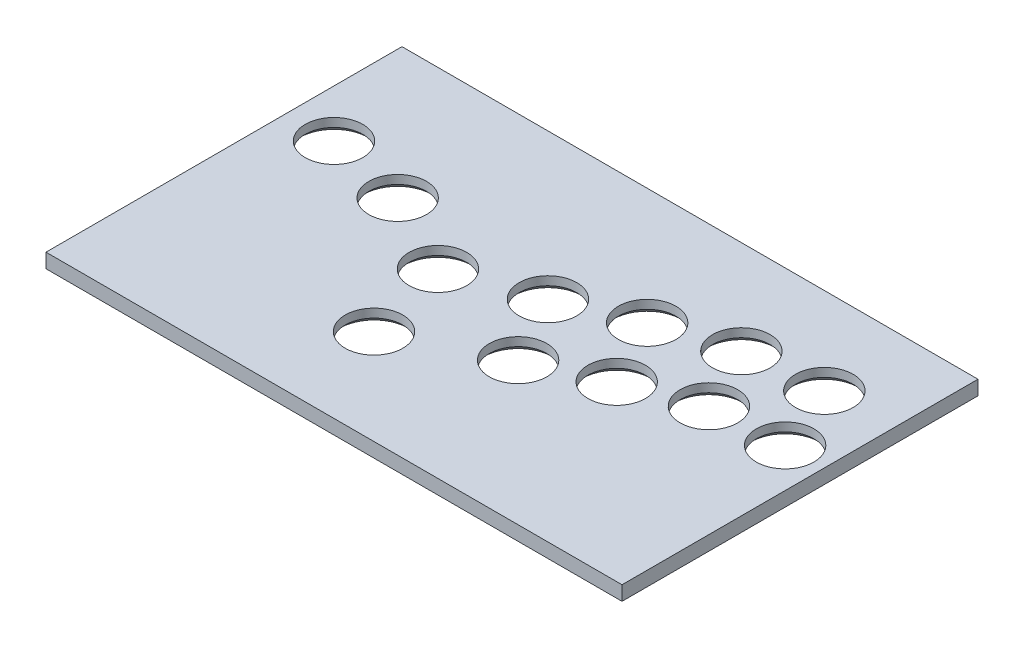
ISO-10303-21;
HEADER;
FILE_DESCRIPTION(('STEP AP214'),'2;1');
FILE_NAME('part.step','',(''),(''),'','','');
FILE_SCHEMA(('AUTOMOTIVE_DESIGN { 1 0 10303 214 1 1 1 1 }'));
ENDSEC;
DATA;
#1=APPLICATION_CONTEXT('core data for automotive mechanical design processes');
#2=APPLICATION_PROTOCOL_DEFINITION('international standard','automotive_design',2000,#1);
#3=PRODUCT_CONTEXT('',#1,'mechanical');
#4=PRODUCT('Part','Part','',(#3));
#5=PRODUCT_RELATED_PRODUCT_CATEGORY('part','',(#4));
#6=PRODUCT_DEFINITION_FORMATION('','',#4);
#7=PRODUCT_DEFINITION_CONTEXT('part definition',#1,'design');
#8=PRODUCT_DEFINITION('design','',#6,#7);
#9=PRODUCT_DEFINITION_SHAPE('','',#8);
#10=(LENGTH_UNIT() NAMED_UNIT(*) SI_UNIT(.MILLI.,.METRE.));
#11=(NAMED_UNIT(*) PLANE_ANGLE_UNIT() SI_UNIT($,.RADIAN.));
#12=(NAMED_UNIT(*) SI_UNIT($,.STERADIAN.) SOLID_ANGLE_UNIT());
#13=UNCERTAINTY_MEASURE_WITH_UNIT(LENGTH_MEASURE(1.E-05),#10,'distance_accuracy_value','');
#14=(GEOMETRIC_REPRESENTATION_CONTEXT(3) GLOBAL_UNCERTAINTY_ASSIGNED_CONTEXT((#13)) GLOBAL_UNIT_ASSIGNED_CONTEXT((#10,
#11,#12)) REPRESENTATION_CONTEXT('',''));
#15=CARTESIAN_POINT('',(0.,0.,0.));
#16=DIRECTION('',(0.,0.,1.));
#17=DIRECTION('',(1.,0.,0.));
#18=AXIS2_PLACEMENT_3D('',#15,#16,#17);
#19=CARTESIAN_POINT('',(0.,5.,0.));
#20=DIRECTION('',(0.,1.,0.));
#21=DIRECTION('',(0.,0.,1.));
#22=AXIS2_PLACEMENT_3D('',#19,#20,#21);
#23=PLANE('',#22);
#24=CARTESIAN_POINT('',(75.0407534181711,5.,29.2050171292449));
#25=DIRECTION('',(0.,1.,0.));
#26=DIRECTION('',(0.,0.,1.));
#27=AXIS2_PLACEMENT_3D('',#24,#25,#26);
#28=CIRCLE('',#27,9.99999999999999);
#29=CARTESIAN_POINT('',(75.0407534181711,5.,39.2050171292449));
#30=VERTEX_POINT('',#29);
#31=EDGE_CURVE('E318',#30,#30,#28,.T.);
#32=ORIENTED_EDGE('',*,*,#31,.F.);
#33=EDGE_LOOP('',(#32));
#34=FACE_BOUND('',#33,.T.);
#35=CARTESIAN_POINT('',(50.034895936804,5.,30.6576941138553));
#36=DIRECTION('',(0.,1.,0.));
#37=DIRECTION('',(0.,0.,1.));
#38=AXIS2_PLACEMENT_3D('',#35,#36,#37);
#39=CIRCLE('',#38,9.99999999999999);
#40=CARTESIAN_POINT('',(50.034895936804,5.,40.6576941138553));
#41=VERTEX_POINT('',#40);
#42=EDGE_CURVE('E328',#41,#41,#39,.T.);
#43=ORIENTED_EDGE('',*,*,#42,.F.);
#44=EDGE_LOOP('',(#43));
#45=FACE_BOUND('',#44,.T.);
#46=CARTESIAN_POINT('',(3.0501318978968,5.,49.9237409318293));
#47=DIRECTION('',(0.,1.,0.));
#48=DIRECTION('',(0.,0.,1.));
#49=AXIS2_PLACEMENT_3D('',#46,#47,#48);
#50=CIRCLE('',#49,10.);
#51=CARTESIAN_POINT('',(3.0501318978968,5.,59.9237409318293));
#52=VERTEX_POINT('',#51);
#53=EDGE_CURVE('E340',#52,#52,#50,.T.);
#54=ORIENTED_EDGE('',*,*,#53,.F.);
#55=EDGE_LOOP('',(#54));
#56=FACE_BOUND('',#55,.T.);
#57=CARTESIAN_POINT('',(65.4494693229309,5.,6.0021017109609));
#58=DIRECTION('',(0.,1.,0.));
#59=DIRECTION('',(0.,0.,1.));
#60=AXIS2_PLACEMENT_3D('',#57,#58,#59);
#61=CIRCLE('',#60,9.99999999999999);
#62=CARTESIAN_POINT('',(65.4494693229309,5.,16.0021017109609));
#63=VERTEX_POINT('',#62);
#64=EDGE_CURVE('E341',#63,#63,#61,.T.);
#65=ORIENTED_EDGE('',*,*,#64,.F.);
#66=EDGE_LOOP('',(#65));
#67=FACE_BOUND('',#66,.T.);
#68=CARTESIAN_POINT('',(-94.8236506551659,5.,15.9793701865854));
#69=DIRECTION('',(0.,1.,0.));
#70=DIRECTION('',(0.,0.,1.));
#71=AXIS2_PLACEMENT_3D('',#68,#69,#70);
#72=CIRCLE('',#71,9.99999999999999);
#73=CARTESIAN_POINT('',(-94.8236506551659,5.,25.9793701865854));
#74=VERTEX_POINT('',#73);
#75=EDGE_CURVE('E352',#74,#74,#72,.T.);
#76=ORIENTED_EDGE('',*,*,#75,.F.);
#77=EDGE_LOOP('',(#76));
#78=FACE_BOUND('',#77,.T.);
#79=CARTESIAN_POINT('',(-30.5462221917152,5.,66.3515096844472));
#80=DIRECTION('',(0.,1.,0.));
#81=DIRECTION('',(0.,0.,1.));
#82=AXIS2_PLACEMENT_3D('',#79,#80,#81);
#83=CIRCLE('',#82,9.99999999999999);
#84=CARTESIAN_POINT('',(-30.5462221917152,5.,76.3515096844472));
#85=VERTEX_POINT('',#84);
#86=EDGE_CURVE('E123',#85,#85,#83,.T.);
#87=ORIENTED_EDGE('',*,*,#86,.F.);
#88=EDGE_LOOP('',(#87));
#89=FACE_BOUND('',#88,.T.);
#90=DIRECTION('',(0.,0.,1.));
#91=VECTOR('',#90,1.);
#92=CARTESIAN_POINT('',(-111.382571904587,5.,-24.1861841220525));
#93=LINE('',#92,#91);
#94=CARTESIAN_POINT('',(-111.382571904587,5.,-24.1861841220525));
#95=VERTEX_POINT('',#94);
#96=CARTESIAN_POINT('',(-111.382571904587,5.,99.4138158779475));
#97=VERTEX_POINT('',#96);
#98=EDGE_CURVE('E99',#95,#97,#93,.T.);
#99=ORIENTED_EDGE('',*,*,#98,.T.);
#100=DIRECTION('',(1.,0.,0.));
#101=VECTOR('',#100,1.);
#102=CARTESIAN_POINT('',(-111.382571904587,5.,99.4138158779475));
#103=LINE('',#102,#101);
#104=CARTESIAN_POINT('',(88.6174280954135,5.,99.4138158779475));
#105=VERTEX_POINT('',#104);
#106=EDGE_CURVE('E92',#97,#105,#103,.T.);
#107=ORIENTED_EDGE('',*,*,#106,.T.);
#108=DIRECTION('',(0.,0.,-1.));
#109=VECTOR('',#108,1.);
#110=CARTESIAN_POINT('',(88.6174280954135,5.,-24.1861841220525));
#111=LINE('',#110,#109);
#112=CARTESIAN_POINT('',(88.6174280954135,5.,-24.1861841220525));
#113=VERTEX_POINT('',#112);
#114=EDGE_CURVE('E98',#105,#113,#111,.T.);
#115=ORIENTED_EDGE('',*,*,#114,.T.);
#116=DIRECTION('',(-1.,0.,0.));
#117=VECTOR('',#116,1.);
#118=CARTESIAN_POINT('',(-111.382571904587,5.,-24.1861841220525));
#119=LINE('',#118,#117);
#120=EDGE_CURVE('E61',#113,#95,#119,.T.);
#121=ORIENTED_EDGE('',*,*,#120,.T.);
#122=EDGE_LOOP('',(#99,#107,#115,#121));
#123=FACE_BOUND('',#122,.T.);
#124=CARTESIAN_POINT('',(-66.6325345394884,5.,22.0571786086309));
#125=DIRECTION('',(0.,1.,0.));
#126=DIRECTION('',(0.,0.,1.));
#127=AXIS2_PLACEMENT_3D('',#124,#125,#126);
#128=CIRCLE('',#127,9.99999999999999);
#129=CARTESIAN_POINT('',(-66.6325345394884,5.,32.0571786086309));
#130=VERTEX_POINT('',#129);
#131=EDGE_CURVE('E353',#130,#130,#128,.T.);
#132=ORIENTED_EDGE('',*,*,#131,.F.);
#133=EDGE_LOOP('',(#132));
#134=FACE_BOUND('',#133,.T.);
#135=CARTESIAN_POINT('',(-10.0903471724497,5.,26.4253037606217));
#136=DIRECTION('',(0.,1.,0.));
#137=DIRECTION('',(0.,0.,1.));
#138=AXIS2_PLACEMENT_3D('',#135,#136,#137);
#139=CIRCLE('',#138,9.99999999999999);
#140=CARTESIAN_POINT('',(-10.0903471724497,5.,36.4253037606217));
#141=VERTEX_POINT('',#140);
#142=EDGE_CURVE('E350',#141,#141,#139,.T.);
#143=ORIENTED_EDGE('',*,*,#142,.F.);
#144=EDGE_LOOP('',(#143));
#145=FACE_BOUND('',#144,.T.);
#146=CARTESIAN_POINT('',(39.1205245605059,5.,8.47636758010787));
#147=DIRECTION('',(0.,1.,0.));
#148=DIRECTION('',(0.,0.,1.));
#149=AXIS2_PLACEMENT_3D('',#146,#147,#148);
#150=CIRCLE('',#149,9.99999999999999);
#151=CARTESIAN_POINT('',(39.1205245605059,5.,18.4763675801079));
#152=VERTEX_POINT('',#151);
#153=EDGE_CURVE('E342',#152,#152,#150,.T.);
#154=ORIENTED_EDGE('',*,*,#153,.F.);
#155=EDGE_LOOP('',(#154));
#156=FACE_BOUND('',#155,.T.);
#157=CARTESIAN_POINT('',(26.6846448120867,5.,39.3297349593777));
#158=DIRECTION('',(0.,1.,0.));
#159=DIRECTION('',(0.,0.,1.));
#160=AXIS2_PLACEMENT_3D('',#157,#158,#159);
#161=CIRCLE('',#160,9.99999999999999);
#162=CARTESIAN_POINT('',(26.6846448120867,5.,49.3297349593777));
#163=VERTEX_POINT('',#162);
#164=EDGE_CURVE('E334',#163,#163,#161,.T.);
#165=ORIENTED_EDGE('',*,*,#164,.F.);
#166=EDGE_LOOP('',(#165));
#167=FACE_BOUND('',#166,.T.);
#168=CARTESIAN_POINT('',(-38.2869015354953,5.,36.4229076061929));
#169=DIRECTION('',(0.,1.,0.));
#170=DIRECTION('',(0.,0.,1.));
#171=AXIS2_PLACEMENT_3D('',#168,#169,#170);
#172=CIRCLE('',#171,9.99999999999999);
#173=CARTESIAN_POINT('',(-38.2869015354953,5.,46.4229076061929));
#174=VERTEX_POINT('',#173);
#175=EDGE_CURVE('E323',#174,#174,#172,.T.);
#176=ORIENTED_EDGE('',*,*,#175,.F.);
#177=EDGE_LOOP('',(#176));
#178=FACE_BOUND('',#177,.T.);
#179=CARTESIAN_POINT('',(14.2287706379459,5.,16.2919651162933));
#180=DIRECTION('',(0.,1.,0.));
#181=DIRECTION('',(0.,0.,1.));
#182=AXIS2_PLACEMENT_3D('',#179,#180,#181);
#183=CIRCLE('',#182,9.99999999999999);
#184=CARTESIAN_POINT('',(14.2287706379459,5.,26.2919651162933));
#185=VERTEX_POINT('',#184);
#186=EDGE_CURVE('E312',#185,#185,#183,.T.);
#187=ORIENTED_EDGE('',*,*,#186,.F.);
#188=EDGE_LOOP('',(#187));
#189=FACE_BOUND('',#188,.T.);
#190=ADVANCED_FACE('F44',(#34,#45,#56,#67,#78,#89,#123,#134,#145,#156,#167,#178,#189),#23,.T.);
#191=CARTESIAN_POINT('',(0.,0.,0.));
#192=DIRECTION('',(0.,1.,0.));
#193=DIRECTION('',(0.,0.,1.));
#194=AXIS2_PLACEMENT_3D('',#191,#192,#193);
#195=PLANE('',#194);
#196=CARTESIAN_POINT('',(-94.8236506551659,0.,15.9793701865854));
#197=DIRECTION('',(0.,1.,0.));
#198=DIRECTION('',(0.,0.,1.));
#199=AXIS2_PLACEMENT_3D('',#196,#197,#198);
#200=CIRCLE('',#199,12.);
#201=CARTESIAN_POINT('',(-94.8236506551659,0.,27.9793701865854));
#202=VERTEX_POINT('',#201);
#203=EDGE_CURVE('E182',#202,#202,#200,.T.);
#204=ORIENTED_EDGE('',*,*,#203,.T.);
#205=EDGE_LOOP('',(#204));
#206=FACE_BOUND('',#205,.T.);
#207=CARTESIAN_POINT('',(-66.6325345394884,0.,22.0571786086309));
#208=DIRECTION('',(0.,1.,0.));
#209=DIRECTION('',(0.,0.,1.));
#210=AXIS2_PLACEMENT_3D('',#207,#208,#209);
#211=CIRCLE('',#210,12.);
#212=CARTESIAN_POINT('',(-66.6325345394884,0.,34.0571786086308));
#213=VERTEX_POINT('',#212);
#214=EDGE_CURVE('E179',#213,#213,#211,.T.);
#215=ORIENTED_EDGE('',*,*,#214,.T.);
#216=EDGE_LOOP('',(#215));
#217=FACE_BOUND('',#216,.T.);
#218=CARTESIAN_POINT('',(-38.2869015354953,0.,36.4229076061929));
#219=DIRECTION('',(0.,1.,0.));
#220=DIRECTION('',(0.,0.,1.));
#221=AXIS2_PLACEMENT_3D('',#218,#219,#220);
#222=CIRCLE('',#221,12.);
#223=CARTESIAN_POINT('',(-38.2869015354953,0.,48.4229076061929));
#224=VERTEX_POINT('',#223);
#225=EDGE_CURVE('E174',#224,#224,#222,.T.);
#226=ORIENTED_EDGE('',*,*,#225,.T.);
#227=EDGE_LOOP('',(#226));
#228=FACE_BOUND('',#227,.T.);
#229=CARTESIAN_POINT('',(-30.5462221917152,0.,66.3515096844472));
#230=DIRECTION('',(0.,1.,0.));
#231=DIRECTION('',(0.,0.,1.));
#232=AXIS2_PLACEMENT_3D('',#229,#230,#231);
#233=CIRCLE('',#232,12.);
#234=CARTESIAN_POINT('',(-30.5462221917152,0.,78.3515096844471));
#235=VERTEX_POINT('',#234);
#236=EDGE_CURVE('E166',#235,#235,#233,.T.);
#237=ORIENTED_EDGE('',*,*,#236,.T.);
#238=EDGE_LOOP('',(#237));
#239=FACE_BOUND('',#238,.T.);
#240=CARTESIAN_POINT('',(3.0501318978968,0.,49.9237409318293));
#241=DIRECTION('',(0.,1.,0.));
#242=DIRECTION('',(0.,0.,1.));
#243=AXIS2_PLACEMENT_3D('',#240,#241,#242);
#244=CIRCLE('',#243,12.);
#245=CARTESIAN_POINT('',(3.0501318978968,0.,61.9237409318293));
#246=VERTEX_POINT('',#245);
#247=EDGE_CURVE('E167',#246,#246,#244,.T.);
#248=ORIENTED_EDGE('',*,*,#247,.T.);
#249=EDGE_LOOP('',(#248));
#250=FACE_BOUND('',#249,.T.);
#251=CARTESIAN_POINT('',(-10.0903471724497,0.,26.4253037606217));
#252=DIRECTION('',(0.,1.,0.));
#253=DIRECTION('',(0.,0.,1.));
#254=AXIS2_PLACEMENT_3D('',#251,#252,#253);
#255=CIRCLE('',#254,12.);
#256=CARTESIAN_POINT('',(-10.0903471724497,0.,38.4253037606217));
#257=VERTEX_POINT('',#256);
#258=EDGE_CURVE('E165',#257,#257,#255,.T.);
#259=ORIENTED_EDGE('',*,*,#258,.T.);
#260=EDGE_LOOP('',(#259));
#261=FACE_BOUND('',#260,.T.);
#262=CARTESIAN_POINT('',(26.6846448120867,0.,39.3297349593777));
#263=DIRECTION('',(0.,1.,0.));
#264=DIRECTION('',(0.,0.,1.));
#265=AXIS2_PLACEMENT_3D('',#262,#263,#264);
#266=CIRCLE('',#265,12.);
#267=CARTESIAN_POINT('',(26.6846448120867,0.,51.3297349593777));
#268=VERTEX_POINT('',#267);
#269=EDGE_CURVE('E158',#268,#268,#266,.T.);
#270=ORIENTED_EDGE('',*,*,#269,.T.);
#271=EDGE_LOOP('',(#270));
#272=FACE_BOUND('',#271,.T.);
#273=CARTESIAN_POINT('',(14.2287706379459,0.,16.2919651162933));
#274=DIRECTION('',(0.,1.,0.));
#275=DIRECTION('',(0.,0.,1.));
#276=AXIS2_PLACEMENT_3D('',#273,#274,#275);
#277=CIRCLE('',#276,12.);
#278=CARTESIAN_POINT('',(14.2287706379459,0.,28.2919651162933));
#279=VERTEX_POINT('',#278);
#280=EDGE_CURVE('E152',#279,#279,#277,.T.);
#281=ORIENTED_EDGE('',*,*,#280,.T.);
#282=EDGE_LOOP('',(#281));
#283=FACE_BOUND('',#282,.T.);
#284=CARTESIAN_POINT('',(50.034895936804,0.,30.6576941138553));
#285=DIRECTION('',(0.,1.,0.));
#286=DIRECTION('',(0.,0.,1.));
#287=AXIS2_PLACEMENT_3D('',#284,#285,#286);
#288=CIRCLE('',#287,12.);
#289=CARTESIAN_POINT('',(50.034895936804,0.,42.6576941138553));
#290=VERTEX_POINT('',#289);
#291=EDGE_CURVE('E147',#290,#290,#288,.T.);
#292=ORIENTED_EDGE('',*,*,#291,.T.);
#293=EDGE_LOOP('',(#292));
#294=FACE_BOUND('',#293,.T.);
#295=CARTESIAN_POINT('',(75.0407534181711,0.,29.2050171292449));
#296=DIRECTION('',(0.,1.,0.));
#297=DIRECTION('',(0.,0.,1.));
#298=AXIS2_PLACEMENT_3D('',#295,#296,#297);
#299=CIRCLE('',#298,12.);
#300=CARTESIAN_POINT('',(75.0407534181711,0.,41.2050171292449));
#301=VERTEX_POINT('',#300);
#302=EDGE_CURVE('E148',#301,#301,#299,.T.);
#303=ORIENTED_EDGE('',*,*,#302,.T.);
#304=EDGE_LOOP('',(#303));
#305=FACE_BOUND('',#304,.T.);
#306=CARTESIAN_POINT('',(39.1205245605059,0.,8.47636758010787));
#307=DIRECTION('',(0.,1.,0.));
#308=DIRECTION('',(0.,0.,1.));
#309=AXIS2_PLACEMENT_3D('',#306,#307,#308);
#310=CIRCLE('',#309,12.);
#311=CARTESIAN_POINT('',(39.1205245605059,0.,20.4763675801079));
#312=VERTEX_POINT('',#311);
#313=EDGE_CURVE('E142',#312,#312,#310,.T.);
#314=ORIENTED_EDGE('',*,*,#313,.T.);
#315=EDGE_LOOP('',(#314));
#316=FACE_BOUND('',#315,.T.);
#317=CARTESIAN_POINT('',(65.4494693229309,0.,6.0021017109609));
#318=DIRECTION('',(0.,1.,0.));
#319=DIRECTION('',(0.,0.,1.));
#320=AXIS2_PLACEMENT_3D('',#317,#318,#319);
#321=CIRCLE('',#320,12.);
#322=CARTESIAN_POINT('',(65.4494693229309,0.,18.0021017109609));
#323=VERTEX_POINT('',#322);
#324=EDGE_CURVE('E140',#323,#323,#321,.T.);
#325=ORIENTED_EDGE('',*,*,#324,.T.);
#326=EDGE_LOOP('',(#325));
#327=FACE_BOUND('',#326,.T.);
#328=DIRECTION('',(0.,0.,1.));
#329=VECTOR('',#328,1.);
#330=CARTESIAN_POINT('',(-111.382571904587,0.,-24.1861841220525));
#331=LINE('',#330,#329);
#332=CARTESIAN_POINT('',(-111.382571904587,0.,-24.1861841220525));
#333=VERTEX_POINT('',#332);
#334=CARTESIAN_POINT('',(-111.382571904587,0.,99.4138158779475));
#335=VERTEX_POINT('',#334);
#336=EDGE_CURVE('E122',#333,#335,#331,.T.);
#337=ORIENTED_EDGE('',*,*,#336,.F.);
#338=DIRECTION('',(-1.,0.,0.));
#339=VECTOR('',#338,1.);
#340=CARTESIAN_POINT('',(-111.382571904587,0.,-24.1861841220525));
#341=LINE('',#340,#339);
#342=CARTESIAN_POINT('',(88.6174280954135,0.,-24.1861841220525));
#343=VERTEX_POINT('',#342);
#344=EDGE_CURVE('E87',#343,#333,#341,.T.);
#345=ORIENTED_EDGE('',*,*,#344,.F.);
#346=DIRECTION('',(0.,0.,-1.));
#347=VECTOR('',#346,1.);
#348=CARTESIAN_POINT('',(88.6174280954135,0.,-24.1861841220525));
#349=LINE('',#348,#347);
#350=CARTESIAN_POINT('',(88.6174280954135,0.,99.4138158779475));
#351=VERTEX_POINT('',#350);
#352=EDGE_CURVE('E82',#351,#343,#349,.T.);
#353=ORIENTED_EDGE('',*,*,#352,.F.);
#354=DIRECTION('',(1.,0.,0.));
#355=VECTOR('',#354,1.);
#356=CARTESIAN_POINT('',(-111.382571904587,0.,99.4138158779475));
#357=LINE('',#356,#355);
#358=EDGE_CURVE('E106',#335,#351,#357,.T.);
#359=ORIENTED_EDGE('',*,*,#358,.F.);
#360=EDGE_LOOP('',(#337,#345,#353,#359));
#361=FACE_BOUND('',#360,.T.);
#362=ADVANCED_FACE('F240',(#206,#217,#228,#239,#250,#261,#272,#283,#294,#305,#316,#327,#361),
#195,.F.);
#363=CARTESIAN_POINT('',(-111.382571904587,5.,-24.1861841220525));
#364=DIRECTION('',(1.,0.,0.));
#365=DIRECTION('',(0.,0.,-1.));
#366=AXIS2_PLACEMENT_3D('',#363,#364,#365);
#367=PLANE('',#366);
#368=ORIENTED_EDGE('',*,*,#336,.T.);
#369=DIRECTION('',(0.,-1.,0.));
#370=VECTOR('',#369,1.);
#371=CARTESIAN_POINT('',(-111.382571904587,5.,99.4138158779475));
#372=LINE('',#371,#370);
#373=EDGE_CURVE('E107',#97,#335,#372,.T.);
#374=ORIENTED_EDGE('',*,*,#373,.F.);
#375=ORIENTED_EDGE('',*,*,#98,.F.);
#376=DIRECTION('',(0.,-1.,0.));
#377=VECTOR('',#376,1.);
#378=CARTESIAN_POINT('',(-111.382571904587,5.,-24.1861841220525));
#379=LINE('',#378,#377);
#380=EDGE_CURVE('E120',#95,#333,#379,.T.);
#381=ORIENTED_EDGE('',*,*,#380,.T.);
#382=EDGE_LOOP('',(#368,#374,#375,#381));
#383=FACE_BOUND('',#382,.T.);
#384=ADVANCED_FACE('F238',(#383),#367,.F.);
#385=CARTESIAN_POINT('',(-111.382571904587,5.,99.4138158779475));
#386=DIRECTION('',(0.,0.,-1.));
#387=DIRECTION('',(-1.,0.,0.));
#388=AXIS2_PLACEMENT_3D('',#385,#386,#387);
#389=PLANE('',#388);
#390=ORIENTED_EDGE('',*,*,#358,.T.);
#391=DIRECTION('',(0.,-1.,0.));
#392=VECTOR('',#391,1.);
#393=CARTESIAN_POINT('',(88.6174280954135,5.,99.4138158779475));
#394=LINE('',#393,#392);
#395=EDGE_CURVE('E102',#105,#351,#394,.T.);
#396=ORIENTED_EDGE('',*,*,#395,.F.);
#397=ORIENTED_EDGE('',*,*,#106,.F.);
#398=ORIENTED_EDGE('',*,*,#373,.T.);
#399=EDGE_LOOP('',(#390,#396,#397,#398));
#400=FACE_BOUND('',#399,.T.);
#401=ADVANCED_FACE('F104',(#400),#389,.F.);
#402=CARTESIAN_POINT('',(88.6174280954135,5.,-24.1861841220525));
#403=DIRECTION('',(-1.,0.,0.));
#404=DIRECTION('',(0.,0.,1.));
#405=AXIS2_PLACEMENT_3D('',#402,#403,#404);
#406=PLANE('',#405);
#407=ORIENTED_EDGE('',*,*,#352,.T.);
#408=DIRECTION('',(0.,-1.,0.));
#409=VECTOR('',#408,1.);
#410=CARTESIAN_POINT('',(88.6174280954135,5.,-24.1861841220525));
#411=LINE('',#410,#409);
#412=EDGE_CURVE('E108',#113,#343,#411,.T.);
#413=ORIENTED_EDGE('',*,*,#412,.F.);
#414=ORIENTED_EDGE('',*,*,#114,.F.);
#415=ORIENTED_EDGE('',*,*,#395,.T.);
#416=EDGE_LOOP('',(#407,#413,#414,#415));
#417=FACE_BOUND('',#416,.T.);
#418=ADVANCED_FACE('F112',(#417),#406,.F.);
#419=CARTESIAN_POINT('',(-111.382571904587,5.,-24.1861841220525));
#420=DIRECTION('',(0.,0.,1.));
#421=DIRECTION('',(1.,0.,0.));
#422=AXIS2_PLACEMENT_3D('',#419,#420,#421);
#423=PLANE('',#422);
#424=ORIENTED_EDGE('',*,*,#344,.T.);
#425=ORIENTED_EDGE('',*,*,#380,.F.);
#426=ORIENTED_EDGE('',*,*,#120,.F.);
#427=ORIENTED_EDGE('',*,*,#412,.T.);
#428=EDGE_LOOP('',(#424,#425,#426,#427));
#429=FACE_BOUND('',#428,.T.);
#430=ADVANCED_FACE('F249',(#429),#423,.F.);
#431=CARTESIAN_POINT('',(-30.5462221917152,5.,66.3515096844472));
#432=DIRECTION('',(0.,-1.,0.));
#433=DIRECTION('',(0.,0.,-1.));
#434=AXIS2_PLACEMENT_3D('',#431,#432,#433);
#435=CYLINDRICAL_SURFACE('',#434,9.99999999999999);
#436=CARTESIAN_POINT('',(-30.5462221917152,1.99999999999998,66.3515096844472));
#437=DIRECTION('',(0.,1.,0.));
#438=DIRECTION('',(0.,0.,1.));
#439=AXIS2_PLACEMENT_3D('',#436,#437,#438);
#440=CIRCLE('',#439,9.99999999999999);
#441=CARTESIAN_POINT('',(-30.5462221917152,1.99999999999998,76.3515096844472));
#442=VERTEX_POINT('',#441);
#443=EDGE_CURVE('E198',#442,#442,#440,.F.);
#444=ORIENTED_EDGE('',*,*,#443,.T.);
#445=EDGE_LOOP('',(#444));
#446=FACE_BOUND('',#445,.T.);
#447=ORIENTED_EDGE('',*,*,#86,.T.);
#448=EDGE_LOOP('',(#447));
#449=FACE_BOUND('',#448,.T.);
#450=ADVANCED_FACE('F246',(#446,#449),#435,.F.);
#451=CARTESIAN_POINT('',(-66.6325345394884,5.,22.0571786086309));
#452=DIRECTION('',(0.,-1.,0.));
#453=DIRECTION('',(0.,0.,-1.));
#454=AXIS2_PLACEMENT_3D('',#451,#452,#453);
#455=CYLINDRICAL_SURFACE('',#454,9.99999999999999);
#456=CARTESIAN_POINT('',(-66.6325345394884,1.99999999999998,22.0571786086309));
#457=DIRECTION('',(0.,1.,0.));
#458=DIRECTION('',(0.,0.,1.));
#459=AXIS2_PLACEMENT_3D('',#456,#457,#458);
#460=CIRCLE('',#459,9.99999999999999);
#461=CARTESIAN_POINT('',(-66.6325345394884,1.99999999999998,32.0571786086309));
#462=VERTEX_POINT('',#461);
#463=EDGE_CURVE('E189',#462,#462,#460,.F.);
#464=ORIENTED_EDGE('',*,*,#463,.T.);
#465=EDGE_LOOP('',(#464));
#466=FACE_BOUND('',#465,.T.);
#467=ORIENTED_EDGE('',*,*,#131,.T.);
#468=EDGE_LOOP('',(#467));
#469=FACE_BOUND('',#468,.T.);
#470=ADVANCED_FACE('F255',(#466,#469),#455,.F.);
#471=CARTESIAN_POINT('',(-94.8236506551659,5.,15.9793701865854));
#472=DIRECTION('',(0.,-1.,0.));
#473=DIRECTION('',(0.,0.,-1.));
#474=AXIS2_PLACEMENT_3D('',#471,#472,#473);
#475=CYLINDRICAL_SURFACE('',#474,9.99999999999999);
#476=CARTESIAN_POINT('',(-94.8236506551659,1.99999999999998,15.9793701865854));
#477=DIRECTION('',(0.,1.,0.));
#478=DIRECTION('',(0.,0.,1.));
#479=AXIS2_PLACEMENT_3D('',#476,#477,#478);
#480=CIRCLE('',#479,9.99999999999999);
#481=CARTESIAN_POINT('',(-94.8236506551659,1.99999999999998,25.9793701865854));
#482=VERTEX_POINT('',#481);
#483=EDGE_CURVE('E183',#482,#482,#480,.F.);
#484=ORIENTED_EDGE('',*,*,#483,.T.);
#485=EDGE_LOOP('',(#484));
#486=FACE_BOUND('',#485,.T.);
#487=ORIENTED_EDGE('',*,*,#75,.T.);
#488=EDGE_LOOP('',(#487));
#489=FACE_BOUND('',#488,.T.);
#490=ADVANCED_FACE('F270',(#486,#489),#475,.F.);
#491=CARTESIAN_POINT('',(-10.0903471724497,5.,26.4253037606217));
#492=DIRECTION('',(0.,-1.,0.));
#493=DIRECTION('',(0.,0.,-1.));
#494=AXIS2_PLACEMENT_3D('',#491,#492,#493);
#495=CYLINDRICAL_SURFACE('',#494,9.99999999999999);
#496=CARTESIAN_POINT('',(-10.0903471724497,1.99999999999998,26.4253037606217));
#497=DIRECTION('',(0.,1.,0.));
#498=DIRECTION('',(0.,0.,1.));
#499=AXIS2_PLACEMENT_3D('',#496,#497,#498);
#500=CIRCLE('',#499,9.99999999999999);
#501=CARTESIAN_POINT('',(-10.0903471724497,1.99999999999998,36.4253037606217));
#502=VERTEX_POINT('',#501);
#503=EDGE_CURVE('E204',#502,#502,#500,.F.);
#504=ORIENTED_EDGE('',*,*,#503,.T.);
#505=EDGE_LOOP('',(#504));
#506=FACE_BOUND('',#505,.T.);
#507=ORIENTED_EDGE('',*,*,#142,.T.);
#508=EDGE_LOOP('',(#507));
#509=FACE_BOUND('',#508,.T.);
#510=ADVANCED_FACE('F271',(#506,#509),#495,.F.);
#511=CARTESIAN_POINT('',(65.4494693229309,5.,6.0021017109609));
#512=DIRECTION('',(0.,-1.,0.));
#513=DIRECTION('',(0.,0.,-1.));
#514=AXIS2_PLACEMENT_3D('',#511,#512,#513);
#515=CYLINDRICAL_SURFACE('',#514,9.99999999999999);
#516=CARTESIAN_POINT('',(65.4494693229309,1.99999999999998,6.0021017109609));
#517=DIRECTION('',(0.,1.,0.));
#518=DIRECTION('',(0.,0.,1.));
#519=AXIS2_PLACEMENT_3D('',#516,#517,#518);
#520=CIRCLE('',#519,9.99999999999999);
#521=CARTESIAN_POINT('',(65.4494693229309,1.99999999999998,16.0021017109609));
#522=VERTEX_POINT('',#521);
#523=EDGE_CURVE('E11',#522,#522,#520,.F.);
#524=ORIENTED_EDGE('',*,*,#523,.T.);
#525=EDGE_LOOP('',(#524));
#526=FACE_BOUND('',#525,.T.);
#527=ORIENTED_EDGE('',*,*,#64,.T.);
#528=EDGE_LOOP('',(#527));
#529=FACE_BOUND('',#528,.T.);
#530=ADVANCED_FACE('F274',(#526,#529),#515,.F.);
#531=CARTESIAN_POINT('',(39.1205245605059,5.,8.47636758010787));
#532=DIRECTION('',(0.,-1.,0.));
#533=DIRECTION('',(0.,0.,-1.));
#534=AXIS2_PLACEMENT_3D('',#531,#532,#533);
#535=CYLINDRICAL_SURFACE('',#534,9.99999999999999);
#536=CARTESIAN_POINT('',(39.1205245605059,1.99999999999998,8.47636758010787));
#537=DIRECTION('',(0.,1.,0.));
#538=DIRECTION('',(0.,0.,1.));
#539=AXIS2_PLACEMENT_3D('',#536,#537,#538);
#540=CIRCLE('',#539,9.99999999999999);
#541=CARTESIAN_POINT('',(39.1205245605059,1.99999999999998,18.4763675801079));
#542=VERTEX_POINT('',#541);
#543=EDGE_CURVE('E57',#542,#542,#540,.F.);
#544=ORIENTED_EDGE('',*,*,#543,.T.);
#545=EDGE_LOOP('',(#544));
#546=FACE_BOUND('',#545,.T.);
#547=ORIENTED_EDGE('',*,*,#153,.T.);
#548=EDGE_LOOP('',(#547));
#549=FACE_BOUND('',#548,.T.);
#550=ADVANCED_FACE('F229',(#546,#549),#535,.F.);
#551=CARTESIAN_POINT('',(3.0501318978968,5.,49.9237409318293));
#552=DIRECTION('',(0.,-1.,0.));
#553=DIRECTION('',(0.,0.,-1.));
#554=AXIS2_PLACEMENT_3D('',#551,#552,#553);
#555=CYLINDRICAL_SURFACE('',#554,10.);
#556=CARTESIAN_POINT('',(3.0501318978968,2.00000000000005,49.9237409318293));
#557=DIRECTION('',(0.,1.,0.));
#558=DIRECTION('',(0.,0.,1.));
#559=AXIS2_PLACEMENT_3D('',#556,#557,#558);
#560=CIRCLE('',#559,10.);
#561=CARTESIAN_POINT('',(3.0501318978968,2.00000000000005,59.9237409318293));
#562=VERTEX_POINT('',#561);
#563=EDGE_CURVE('E199',#562,#562,#560,.F.);
#564=ORIENTED_EDGE('',*,*,#563,.T.);
#565=EDGE_LOOP('',(#564));
#566=FACE_BOUND('',#565,.T.);
#567=ORIENTED_EDGE('',*,*,#53,.T.);
#568=EDGE_LOOP('',(#567));
#569=FACE_BOUND('',#568,.T.);
#570=ADVANCED_FACE('F285',(#566,#569),#555,.F.);
#571=CARTESIAN_POINT('',(26.6846448120867,5.,39.3297349593777));
#572=DIRECTION('',(0.,-1.,0.));
#573=DIRECTION('',(0.,0.,-1.));
#574=AXIS2_PLACEMENT_3D('',#571,#572,#573);
#575=CYLINDRICAL_SURFACE('',#574,9.99999999999999);
#576=CARTESIAN_POINT('',(26.6846448120867,1.99999999999998,39.3297349593777));
#577=DIRECTION('',(0.,1.,0.));
#578=DIRECTION('',(0.,0.,1.));
#579=AXIS2_PLACEMENT_3D('',#576,#577,#578);
#580=CIRCLE('',#579,9.99999999999999);
#581=CARTESIAN_POINT('',(26.6846448120867,1.99999999999998,49.3297349593777));
#582=VERTEX_POINT('',#581);
#583=EDGE_CURVE('E208',#582,#582,#580,.F.);
#584=ORIENTED_EDGE('',*,*,#583,.T.);
#585=EDGE_LOOP('',(#584));
#586=FACE_BOUND('',#585,.T.);
#587=ORIENTED_EDGE('',*,*,#164,.T.);
#588=EDGE_LOOP('',(#587));
#589=FACE_BOUND('',#588,.T.);
#590=ADVANCED_FACE('F283',(#586,#589),#575,.F.);
#591=CARTESIAN_POINT('',(50.034895936804,5.,30.6576941138553));
#592=DIRECTION('',(0.,-1.,0.));
#593=DIRECTION('',(0.,0.,-1.));
#594=AXIS2_PLACEMENT_3D('',#591,#592,#593);
#595=CYLINDRICAL_SURFACE('',#594,9.99999999999999);
#596=CARTESIAN_POINT('',(50.034895936804,1.99999999999998,30.6576941138553));
#597=DIRECTION('',(0.,1.,0.));
#598=DIRECTION('',(0.,0.,1.));
#599=AXIS2_PLACEMENT_3D('',#596,#597,#598);
#600=CIRCLE('',#599,9.99999999999999);
#601=CARTESIAN_POINT('',(50.034895936804,1.99999999999998,40.6576941138553));
#602=VERTEX_POINT('',#601);
#603=EDGE_CURVE('E216',#602,#602,#600,.F.);
#604=ORIENTED_EDGE('',*,*,#603,.T.);
#605=EDGE_LOOP('',(#604));
#606=FACE_BOUND('',#605,.T.);
#607=ORIENTED_EDGE('',*,*,#42,.T.);
#608=EDGE_LOOP('',(#607));
#609=FACE_BOUND('',#608,.T.);
#610=ADVANCED_FACE('F286',(#606,#609),#595,.F.);
#611=CARTESIAN_POINT('',(-38.2869015354953,5.,36.4229076061929));
#612=DIRECTION('',(0.,-1.,0.));
#613=DIRECTION('',(0.,0.,-1.));
#614=AXIS2_PLACEMENT_3D('',#611,#612,#613);
#615=CYLINDRICAL_SURFACE('',#614,9.99999999999999);
#616=CARTESIAN_POINT('',(-38.2869015354953,1.99999999999998,36.4229076061929));
#617=DIRECTION('',(0.,1.,0.));
#618=DIRECTION('',(0.,0.,1.));
#619=AXIS2_PLACEMENT_3D('',#616,#617,#618);
#620=CIRCLE('',#619,9.99999999999999);
#621=CARTESIAN_POINT('',(-38.2869015354953,1.99999999999998,46.4229076061929));
#622=VERTEX_POINT('',#621);
#623=EDGE_CURVE('E194',#622,#622,#620,.F.);
#624=ORIENTED_EDGE('',*,*,#623,.T.);
#625=EDGE_LOOP('',(#624));
#626=FACE_BOUND('',#625,.T.);
#627=ORIENTED_EDGE('',*,*,#175,.T.);
#628=EDGE_LOOP('',(#627));
#629=FACE_BOUND('',#628,.T.);
#630=ADVANCED_FACE('F291',(#626,#629),#615,.F.);
#631=CARTESIAN_POINT('',(75.0407534181711,5.,29.2050171292449));
#632=DIRECTION('',(0.,-1.,0.));
#633=DIRECTION('',(0.,0.,-1.));
#634=AXIS2_PLACEMENT_3D('',#631,#632,#633);
#635=CYLINDRICAL_SURFACE('',#634,9.99999999999999);
#636=CARTESIAN_POINT('',(75.0407534181711,1.99999999999998,29.2050171292449));
#637=DIRECTION('',(0.,1.,0.));
#638=DIRECTION('',(0.,0.,1.));
#639=AXIS2_PLACEMENT_3D('',#636,#637,#638);
#640=CIRCLE('',#639,9.99999999999999);
#641=CARTESIAN_POINT('',(75.0407534181711,1.99999999999998,39.2050171292449));
#642=VERTEX_POINT('',#641);
#643=EDGE_CURVE('E219',#642,#642,#640,.F.);
#644=ORIENTED_EDGE('',*,*,#643,.T.);
#645=EDGE_LOOP('',(#644));
#646=FACE_BOUND('',#645,.T.);
#647=ORIENTED_EDGE('',*,*,#31,.T.);
#648=EDGE_LOOP('',(#647));
#649=FACE_BOUND('',#648,.T.);
#650=ADVANCED_FACE('F300',(#646,#649),#635,.F.);
#651=CARTESIAN_POINT('',(14.2287706379459,5.,16.2919651162933));
#652=DIRECTION('',(0.,-1.,0.));
#653=DIRECTION('',(0.,0.,-1.));
#654=AXIS2_PLACEMENT_3D('',#651,#652,#653);
#655=CYLINDRICAL_SURFACE('',#654,9.99999999999999);
#656=CARTESIAN_POINT('',(14.2287706379459,1.99999999999998,16.2919651162933));
#657=DIRECTION('',(0.,1.,0.));
#658=DIRECTION('',(0.,0.,1.));
#659=AXIS2_PLACEMENT_3D('',#656,#657,#658);
#660=CIRCLE('',#659,9.99999999999999);
#661=CARTESIAN_POINT('',(14.2287706379459,1.99999999999998,26.2919651162933));
#662=VERTEX_POINT('',#661);
#663=EDGE_CURVE('E215',#662,#662,#660,.F.);
#664=ORIENTED_EDGE('',*,*,#663,.T.);
#665=EDGE_LOOP('',(#664));
#666=FACE_BOUND('',#665,.T.);
#667=ORIENTED_EDGE('',*,*,#186,.T.);
#668=EDGE_LOOP('',(#667));
#669=FACE_BOUND('',#668,.T.);
#670=ADVANCED_FACE('F302',(#666,#669),#655,.F.);
#671=CARTESIAN_POINT('',(-94.8236506551659,0.,15.9793701865854));
#672=DIRECTION('',(0.,-1.,0.));
#673=DIRECTION('',(0.,0.,-1.));
#674=AXIS2_PLACEMENT_3D('',#671,#672,#673);
#675=CONICAL_SURFACE('',#674,12.,0.78539816339745);
#676=ORIENTED_EDGE('',*,*,#483,.F.);
#677=EDGE_LOOP('',(#676));
#678=FACE_BOUND('',#677,.T.);
#679=ORIENTED_EDGE('',*,*,#203,.F.);
#680=EDGE_LOOP('',(#679));
#681=FACE_BOUND('',#680,.T.);
#682=ADVANCED_FACE('F301',(#678,#681),#675,.F.);
#683=CARTESIAN_POINT('',(-66.6325345394884,0.,22.0571786086309));
#684=DIRECTION('',(0.,-1.,0.));
#685=DIRECTION('',(0.,0.,-1.));
#686=AXIS2_PLACEMENT_3D('',#683,#684,#685);
#687=CONICAL_SURFACE('',#686,12.,0.78539816339745);
#688=ORIENTED_EDGE('',*,*,#463,.F.);
#689=EDGE_LOOP('',(#688));
#690=FACE_BOUND('',#689,.T.);
#691=ORIENTED_EDGE('',*,*,#214,.F.);
#692=EDGE_LOOP('',(#691));
#693=FACE_BOUND('',#692,.T.);
#694=ADVANCED_FACE('F306',(#690,#693),#687,.F.);
#695=CARTESIAN_POINT('',(-38.2869015354953,0.,36.4229076061929));
#696=DIRECTION('',(0.,-1.,0.));
#697=DIRECTION('',(0.,0.,-1.));
#698=AXIS2_PLACEMENT_3D('',#695,#696,#697);
#699=CONICAL_SURFACE('',#698,12.,0.78539816339745);
#700=ORIENTED_EDGE('',*,*,#623,.F.);
#701=EDGE_LOOP('',(#700));
#702=FACE_BOUND('',#701,.T.);
#703=ORIENTED_EDGE('',*,*,#225,.F.);
#704=EDGE_LOOP('',(#703));
#705=FACE_BOUND('',#704,.T.);
#706=ADVANCED_FACE('F451',(#702,#705),#699,.F.);
#707=CARTESIAN_POINT('',(-30.5462221917152,0.,66.3515096844472));
#708=DIRECTION('',(0.,-1.,0.));
#709=DIRECTION('',(0.,0.,-1.));
#710=AXIS2_PLACEMENT_3D('',#707,#708,#709);
#711=CONICAL_SURFACE('',#710,12.,0.78539816339745);
#712=ORIENTED_EDGE('',*,*,#443,.F.);
#713=EDGE_LOOP('',(#712));
#714=FACE_BOUND('',#713,.T.);
#715=ORIENTED_EDGE('',*,*,#236,.F.);
#716=EDGE_LOOP('',(#715));
#717=FACE_BOUND('',#716,.T.);
#718=ADVANCED_FACE('F450',(#714,#717),#711,.F.);
#719=CARTESIAN_POINT('',(3.0501318978968,0.,49.9237409318293));
#720=DIRECTION('',(0.,-1.,0.));
#721=DIRECTION('',(0.,0.,-1.));
#722=AXIS2_PLACEMENT_3D('',#719,#720,#721);
#723=CONICAL_SURFACE('',#722,12.,0.785398163397443);
#724=ORIENTED_EDGE('',*,*,#563,.F.);
#725=EDGE_LOOP('',(#724));
#726=FACE_BOUND('',#725,.T.);
#727=ORIENTED_EDGE('',*,*,#247,.F.);
#728=EDGE_LOOP('',(#727));
#729=FACE_BOUND('',#728,.T.);
#730=ADVANCED_FACE('F439',(#726,#729),#723,.F.);
#731=CARTESIAN_POINT('',(-10.0903471724497,0.,26.4253037606217));
#732=DIRECTION('',(0.,-1.,0.));
#733=DIRECTION('',(0.,0.,-1.));
#734=AXIS2_PLACEMENT_3D('',#731,#732,#733);
#735=CONICAL_SURFACE('',#734,12.,0.78539816339745);
#736=ORIENTED_EDGE('',*,*,#503,.F.);
#737=EDGE_LOOP('',(#736));
#738=FACE_BOUND('',#737,.T.);
#739=ORIENTED_EDGE('',*,*,#258,.F.);
#740=EDGE_LOOP('',(#739));
#741=FACE_BOUND('',#740,.T.);
#742=ADVANCED_FACE('F433',(#738,#741),#735,.F.);
#743=CARTESIAN_POINT('',(26.6846448120867,0.,39.3297349593777));
#744=DIRECTION('',(0.,-1.,0.));
#745=DIRECTION('',(0.,0.,-1.));
#746=AXIS2_PLACEMENT_3D('',#743,#744,#745);
#747=CONICAL_SURFACE('',#746,12.,0.78539816339745);
#748=ORIENTED_EDGE('',*,*,#583,.F.);
#749=EDGE_LOOP('',(#748));
#750=FACE_BOUND('',#749,.T.);
#751=ORIENTED_EDGE('',*,*,#269,.F.);
#752=EDGE_LOOP('',(#751));
#753=FACE_BOUND('',#752,.T.);
#754=ADVANCED_FACE('F393',(#750,#753),#747,.F.);
#755=CARTESIAN_POINT('',(14.2287706379459,0.,16.2919651162933));
#756=DIRECTION('',(0.,-1.,0.));
#757=DIRECTION('',(0.,0.,-1.));
#758=AXIS2_PLACEMENT_3D('',#755,#756,#757);
#759=CONICAL_SURFACE('',#758,12.,0.78539816339745);
#760=ORIENTED_EDGE('',*,*,#663,.F.);
#761=EDGE_LOOP('',(#760));
#762=FACE_BOUND('',#761,.T.);
#763=ORIENTED_EDGE('',*,*,#280,.F.);
#764=EDGE_LOOP('',(#763));
#765=FACE_BOUND('',#764,.T.);
#766=ADVANCED_FACE('F392',(#762,#765),#759,.F.);
#767=CARTESIAN_POINT('',(50.034895936804,0.,30.6576941138553));
#768=DIRECTION('',(0.,-1.,0.));
#769=DIRECTION('',(0.,0.,-1.));
#770=AXIS2_PLACEMENT_3D('',#767,#768,#769);
#771=CONICAL_SURFACE('',#770,12.,0.78539816339745);
#772=ORIENTED_EDGE('',*,*,#603,.F.);
#773=EDGE_LOOP('',(#772));
#774=FACE_BOUND('',#773,.T.);
#775=ORIENTED_EDGE('',*,*,#291,.F.);
#776=EDGE_LOOP('',(#775));
#777=FACE_BOUND('',#776,.T.);
#778=ADVANCED_FACE('F391',(#774,#777),#771,.F.);
#779=CARTESIAN_POINT('',(75.0407534181711,0.,29.2050171292449));
#780=DIRECTION('',(0.,-1.,0.));
#781=DIRECTION('',(0.,0.,-1.));
#782=AXIS2_PLACEMENT_3D('',#779,#780,#781);
#783=CONICAL_SURFACE('',#782,12.,0.78539816339745);
#784=ORIENTED_EDGE('',*,*,#643,.F.);
#785=EDGE_LOOP('',(#784));
#786=FACE_BOUND('',#785,.T.);
#787=ORIENTED_EDGE('',*,*,#302,.F.);
#788=EDGE_LOOP('',(#787));
#789=FACE_BOUND('',#788,.T.);
#790=ADVANCED_FACE('F231',(#786,#789),#783,.F.);
#791=CARTESIAN_POINT('',(39.1205245605059,0.,8.47636758010787));
#792=DIRECTION('',(0.,-1.,0.));
#793=DIRECTION('',(0.,0.,-1.));
#794=AXIS2_PLACEMENT_3D('',#791,#792,#793);
#795=CONICAL_SURFACE('',#794,12.,0.78539816339745);
#796=ORIENTED_EDGE('',*,*,#543,.F.);
#797=EDGE_LOOP('',(#796));
#798=FACE_BOUND('',#797,.T.);
#799=ORIENTED_EDGE('',*,*,#313,.F.);
#800=EDGE_LOOP('',(#799));
#801=FACE_BOUND('',#800,.T.);
#802=ADVANCED_FACE('F232',(#798,#801),#795,.F.);
#803=CARTESIAN_POINT('',(65.4494693229309,0.,6.0021017109609));
#804=DIRECTION('',(0.,-1.,0.));
#805=DIRECTION('',(0.,0.,-1.));
#806=AXIS2_PLACEMENT_3D('',#803,#804,#805);
#807=CONICAL_SURFACE('',#806,12.,0.78539816339745);
#808=ORIENTED_EDGE('',*,*,#523,.F.);
#809=EDGE_LOOP('',(#808));
#810=FACE_BOUND('',#809,.T.);
#811=ORIENTED_EDGE('',*,*,#324,.F.);
#812=EDGE_LOOP('',(#811));
#813=FACE_BOUND('',#812,.T.);
#814=ADVANCED_FACE('F48',(#810,#813),#807,.F.);
#815=CLOSED_SHELL('',(#190,#362,#384,#401,#418,#430,#450,#470,#490,#510,#530,#550,#570,#590,
#610,#630,#650,#670,#682,#694,#706,#718,#730,#742,#754,#766,#778,#790,#802,#814));
#816=MANIFOLD_SOLID_BREP('B2',#815);
#817=ADVANCED_BREP_SHAPE_REPRESENTATION('',(#18,#816),#14);
#818=SHAPE_DEFINITION_REPRESENTATION(#9,#817);
ENDSEC;
END-ISO-10303-21;
